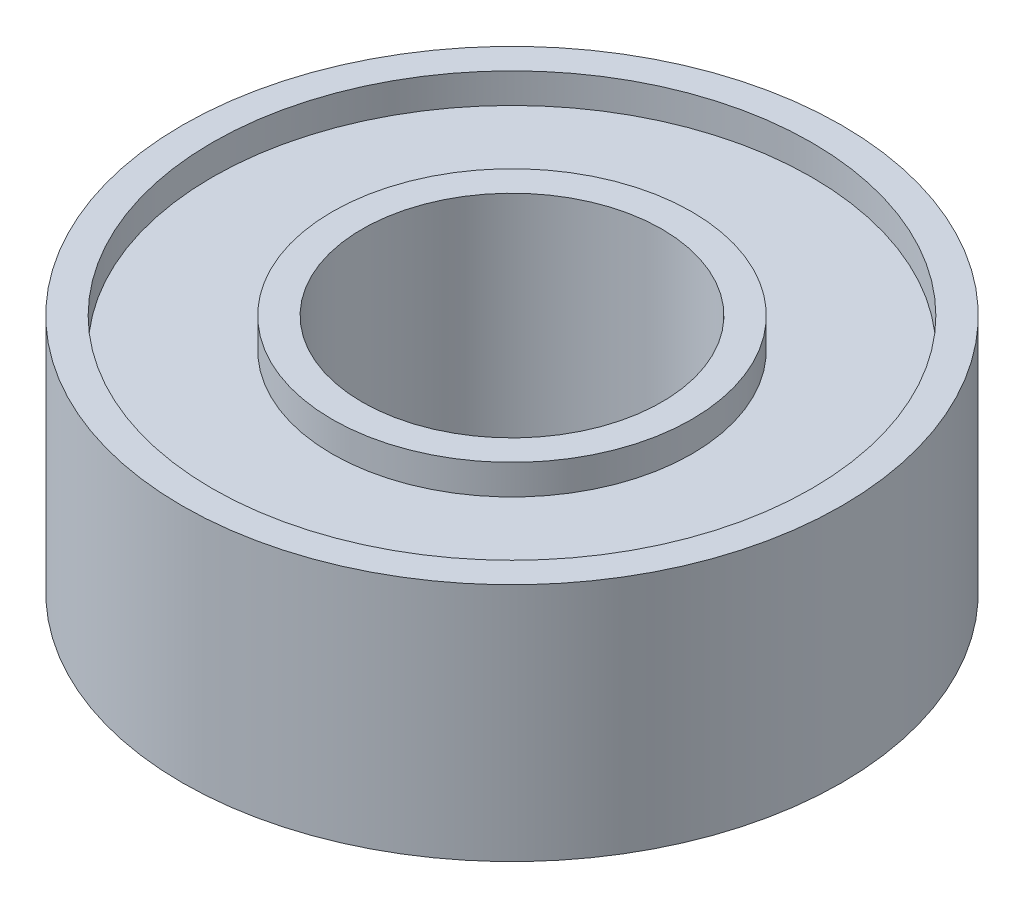
ISO-10303-21;
HEADER;
FILE_DESCRIPTION(('STEP AP214'),'2;1');
FILE_NAME('part.step','',(''),(''),'','','');
FILE_SCHEMA(('AUTOMOTIVE_DESIGN { 1 0 10303 214 1 1 1 1 }'));
ENDSEC;
DATA;
#1=APPLICATION_CONTEXT('core data for automotive mechanical design processes');
#2=APPLICATION_PROTOCOL_DEFINITION('international standard','automotive_design',2000,#1);
#3=PRODUCT_CONTEXT('',#1,'mechanical');
#4=PRODUCT('Part','Part','',(#3));
#5=PRODUCT_RELATED_PRODUCT_CATEGORY('part','',(#4));
#6=PRODUCT_DEFINITION_FORMATION('','',#4);
#7=PRODUCT_DEFINITION_CONTEXT('part definition',#1,'design');
#8=PRODUCT_DEFINITION('design','',#6,#7);
#9=PRODUCT_DEFINITION_SHAPE('','',#8);
#10=(LENGTH_UNIT() NAMED_UNIT(*) SI_UNIT(.MILLI.,.METRE.));
#11=(NAMED_UNIT(*) PLANE_ANGLE_UNIT() SI_UNIT($,.RADIAN.));
#12=(NAMED_UNIT(*) SI_UNIT($,.STERADIAN.) SOLID_ANGLE_UNIT());
#13=UNCERTAINTY_MEASURE_WITH_UNIT(LENGTH_MEASURE(1.E-05),#10,'distance_accuracy_value','');
#14=(GEOMETRIC_REPRESENTATION_CONTEXT(3) GLOBAL_UNCERTAINTY_ASSIGNED_CONTEXT((#13)) GLOBAL_UNIT_ASSIGNED_CONTEXT((#10,
#11,#12)) REPRESENTATION_CONTEXT('',''));
#15=CARTESIAN_POINT('',(0.,0.,0.));
#16=DIRECTION('',(0.,0.,1.));
#17=DIRECTION('',(1.,0.,0.));
#18=AXIS2_PLACEMENT_3D('',#15,#16,#17);
#19=CARTESIAN_POINT('',(0.,0.,0.));
#20=DIRECTION('',(0.,1.,0.));
#21=DIRECTION('',(0.,0.,1.));
#22=AXIS2_PLACEMENT_3D('',#19,#20,#21);
#23=PLANE('',#22);
#24=CARTESIAN_POINT('',(0.,0.,0.));
#25=DIRECTION('',(0.,1.,0.));
#26=DIRECTION('',(0.,0.,1.));
#27=AXIS2_PLACEMENT_3D('',#24,#25,#26);
#28=CIRCLE('',#27,2.5);
#29=CARTESIAN_POINT('',(0.,0.,2.5));
#30=VERTEX_POINT('',#29);
#31=EDGE_CURVE('E45',#30,#30,#28,.T.);
#32=ORIENTED_EDGE('',*,*,#31,.T.);
#33=EDGE_LOOP('',(#32));
#34=FACE_BOUND('',#33,.T.);
#35=CARTESIAN_POINT('',(0.,0.,0.));
#36=DIRECTION('',(0.,1.,0.));
#37=DIRECTION('',(0.,0.,1.));
#38=AXIS2_PLACEMENT_3D('',#35,#36,#37);
#39=CIRCLE('',#38,3.);
#40=CARTESIAN_POINT('',(0.,0.,3.));
#41=VERTEX_POINT('',#40);
#42=EDGE_CURVE('E69',#41,#41,#39,.T.);
#43=ORIENTED_EDGE('',*,*,#42,.F.);
#44=EDGE_LOOP('',(#43));
#45=FACE_BOUND('',#44,.T.);
#46=ADVANCED_FACE('F32',(#34,#45),#23,.F.);
#47=CARTESIAN_POINT('',(0.,4.,0.));
#48=DIRECTION('',(0.,1.,0.));
#49=DIRECTION('',(0.,0.,1.));
#50=AXIS2_PLACEMENT_3D('',#47,#48,#49);
#51=PLANE('',#50);
#52=CARTESIAN_POINT('',(0.,4.,0.));
#53=DIRECTION('',(0.,1.,0.));
#54=DIRECTION('',(0.,0.,1.));
#55=AXIS2_PLACEMENT_3D('',#52,#53,#54);
#56=CIRCLE('',#55,2.5);
#57=CARTESIAN_POINT('',(0.,4.,2.5));
#58=VERTEX_POINT('',#57);
#59=EDGE_CURVE('E43',#58,#58,#56,.T.);
#60=ORIENTED_EDGE('',*,*,#59,.F.);
#61=EDGE_LOOP('',(#60));
#62=FACE_BOUND('',#61,.T.);
#63=CARTESIAN_POINT('',(0.,4.,0.));
#64=DIRECTION('',(0.,1.,0.));
#65=DIRECTION('',(0.,0.,1.));
#66=AXIS2_PLACEMENT_3D('',#63,#64,#65);
#67=CIRCLE('',#66,3.);
#68=CARTESIAN_POINT('',(0.,4.,3.));
#69=VERTEX_POINT('',#68);
#70=EDGE_CURVE('E57',#69,#69,#67,.T.);
#71=ORIENTED_EDGE('',*,*,#70,.T.);
#72=EDGE_LOOP('',(#71));
#73=FACE_BOUND('',#72,.T.);
#74=ADVANCED_FACE('F85',(#62,#73),#51,.T.);
#75=CARTESIAN_POINT('',(0.,4.,0.));
#76=DIRECTION('',(0.,1.,0.));
#77=DIRECTION('',(0.,0.,1.));
#78=AXIS2_PLACEMENT_3D('',#75,#76,#77);
#79=CIRCLE('',#78,5.);
#80=CARTESIAN_POINT('',(0.,4.,5.));
#81=VERTEX_POINT('',#80);
#82=EDGE_CURVE('E51',#81,#81,#79,.T.);
#83=ORIENTED_EDGE('',*,*,#82,.F.);
#84=EDGE_LOOP('',(#83));
#85=FACE_BOUND('',#84,.T.);
#86=CARTESIAN_POINT('',(0.,4.,0.));
#87=DIRECTION('',(0.,1.,0.));
#88=DIRECTION('',(0.,0.,1.));
#89=AXIS2_PLACEMENT_3D('',#86,#87,#88);
#90=CIRCLE('',#89,5.5);
#91=CARTESIAN_POINT('',(0.,4.,5.5));
#92=VERTEX_POINT('',#91);
#93=EDGE_CURVE('E10',#92,#92,#90,.T.);
#94=ORIENTED_EDGE('',*,*,#93,.T.);
#95=EDGE_LOOP('',(#94));
#96=FACE_BOUND('',#95,.T.);
#97=ADVANCED_FACE('F91',(#85,#96),#51,.T.);
#98=CARTESIAN_POINT('',(0.,0.,0.));
#99=DIRECTION('',(0.,1.,0.));
#100=DIRECTION('',(0.,0.,1.));
#101=AXIS2_PLACEMENT_3D('',#98,#99,#100);
#102=CIRCLE('',#101,5.);
#103=CARTESIAN_POINT('',(0.,0.,5.));
#104=VERTEX_POINT('',#103);
#105=EDGE_CURVE('E63',#104,#104,#102,.T.);
#106=ORIENTED_EDGE('',*,*,#105,.T.);
#107=EDGE_LOOP('',(#106));
#108=FACE_BOUND('',#107,.T.);
#109=CARTESIAN_POINT('',(0.,0.,0.));
#110=DIRECTION('',(0.,1.,0.));
#111=DIRECTION('',(0.,0.,1.));
#112=AXIS2_PLACEMENT_3D('',#109,#110,#111);
#113=CIRCLE('',#112,5.5);
#114=CARTESIAN_POINT('',(0.,0.,5.5));
#115=VERTEX_POINT('',#114);
#116=EDGE_CURVE('E36',#115,#115,#113,.T.);
#117=ORIENTED_EDGE('',*,*,#116,.F.);
#118=EDGE_LOOP('',(#117));
#119=FACE_BOUND('',#118,.T.);
#120=ADVANCED_FACE('F87',(#108,#119),#23,.F.);
#121=CARTESIAN_POINT('',(0.,4.,0.));
#122=DIRECTION('',(0.,-1.,0.));
#123=DIRECTION('',(0.,0.,-1.));
#124=AXIS2_PLACEMENT_3D('',#121,#122,#123);
#125=CYLINDRICAL_SURFACE('',#124,5.5);
#126=ORIENTED_EDGE('',*,*,#93,.F.);
#127=EDGE_LOOP('',(#126));
#128=FACE_BOUND('',#127,.T.);
#129=ORIENTED_EDGE('',*,*,#116,.T.);
#130=EDGE_LOOP('',(#129));
#131=FACE_BOUND('',#130,.T.);
#132=ADVANCED_FACE('F34',(#128,#131),#125,.T.);
#133=CARTESIAN_POINT('',(0.,4.,0.));
#134=DIRECTION('',(0.,-1.,0.));
#135=DIRECTION('',(0.,0.,-1.));
#136=AXIS2_PLACEMENT_3D('',#133,#134,#135);
#137=CYLINDRICAL_SURFACE('',#136,2.5);
#138=ORIENTED_EDGE('',*,*,#59,.T.);
#139=EDGE_LOOP('',(#138));
#140=FACE_BOUND('',#139,.T.);
#141=ORIENTED_EDGE('',*,*,#31,.F.);
#142=EDGE_LOOP('',(#141));
#143=FACE_BOUND('',#142,.T.);
#144=ADVANCED_FACE('F100',(#140,#143),#137,.F.);
#145=CARTESIAN_POINT('',(0.,3.5,0.));
#146=DIRECTION('',(0.,1.,0.));
#147=DIRECTION('',(0.,0.,1.));
#148=AXIS2_PLACEMENT_3D('',#145,#146,#147);
#149=CYLINDRICAL_SURFACE('',#148,5.);
#150=CARTESIAN_POINT('',(0.,3.5,0.));
#151=DIRECTION('',(0.,1.,0.));
#152=DIRECTION('',(0.,0.,1.));
#153=AXIS2_PLACEMENT_3D('',#150,#151,#152);
#154=CIRCLE('',#153,5.);
#155=CARTESIAN_POINT('',(0.,3.5,5.));
#156=VERTEX_POINT('',#155);
#157=EDGE_CURVE('E48',#156,#156,#154,.T.);
#158=ORIENTED_EDGE('',*,*,#157,.F.);
#159=EDGE_LOOP('',(#158));
#160=FACE_BOUND('',#159,.T.);
#161=ORIENTED_EDGE('',*,*,#82,.T.);
#162=EDGE_LOOP('',(#161));
#163=FACE_BOUND('',#162,.T.);
#164=ADVANCED_FACE('F124',(#160,#163),#149,.F.);
#165=CARTESIAN_POINT('',(0.,3.5,0.));
#166=DIRECTION('',(0.,1.,0.));
#167=DIRECTION('',(0.,0.,1.));
#168=AXIS2_PLACEMENT_3D('',#165,#166,#167);
#169=PLANE('',#168);
#170=CARTESIAN_POINT('',(0.,3.5,0.));
#171=DIRECTION('',(0.,1.,0.));
#172=DIRECTION('',(0.,0.,1.));
#173=AXIS2_PLACEMENT_3D('',#170,#171,#172);
#174=CIRCLE('',#173,3.);
#175=CARTESIAN_POINT('',(0.,3.5,3.));
#176=VERTEX_POINT('',#175);
#177=EDGE_CURVE('E54',#176,#176,#174,.T.);
#178=ORIENTED_EDGE('',*,*,#177,.F.);
#179=EDGE_LOOP('',(#178));
#180=FACE_BOUND('',#179,.T.);
#181=ORIENTED_EDGE('',*,*,#157,.T.);
#182=EDGE_LOOP('',(#181));
#183=FACE_BOUND('',#182,.T.);
#184=ADVANCED_FACE('F120',(#180,#183),#169,.T.);
#185=CARTESIAN_POINT('',(0.,3.5,0.));
#186=DIRECTION('',(0.,1.,0.));
#187=DIRECTION('',(0.,0.,1.));
#188=AXIS2_PLACEMENT_3D('',#185,#186,#187);
#189=CYLINDRICAL_SURFACE('',#188,3.);
#190=ORIENTED_EDGE('',*,*,#177,.T.);
#191=EDGE_LOOP('',(#190));
#192=FACE_BOUND('',#191,.T.);
#193=ORIENTED_EDGE('',*,*,#70,.F.);
#194=EDGE_LOOP('',(#193));
#195=FACE_BOUND('',#194,.T.);
#196=ADVANCED_FACE('F114',(#192,#195),#189,.T.);
#197=CARTESIAN_POINT('',(0.,0.5,0.));
#198=DIRECTION('',(0.,1.,0.));
#199=DIRECTION('',(0.,0.,1.));
#200=AXIS2_PLACEMENT_3D('',#197,#198,#199);
#201=PLANE('',#200);
#202=CARTESIAN_POINT('',(0.,0.5,0.));
#203=DIRECTION('',(0.,1.,0.));
#204=DIRECTION('',(0.,0.,1.));
#205=AXIS2_PLACEMENT_3D('',#202,#203,#204);
#206=CIRCLE('',#205,5.);
#207=CARTESIAN_POINT('',(0.,0.5,5.));
#208=VERTEX_POINT('',#207);
#209=EDGE_CURVE('E60',#208,#208,#206,.T.);
#210=ORIENTED_EDGE('',*,*,#209,.F.);
#211=EDGE_LOOP('',(#210));
#212=FACE_BOUND('',#211,.T.);
#213=CARTESIAN_POINT('',(0.,0.5,0.));
#214=DIRECTION('',(0.,1.,0.));
#215=DIRECTION('',(0.,0.,1.));
#216=AXIS2_PLACEMENT_3D('',#213,#214,#215);
#217=CIRCLE('',#216,3.);
#218=CARTESIAN_POINT('',(0.,0.5,3.));
#219=VERTEX_POINT('',#218);
#220=EDGE_CURVE('E66',#219,#219,#217,.T.);
#221=ORIENTED_EDGE('',*,*,#220,.T.);
#222=EDGE_LOOP('',(#221));
#223=FACE_BOUND('',#222,.T.);
#224=ADVANCED_FACE('F75',(#212,#223),#201,.F.);
#225=CARTESIAN_POINT('',(0.,0.5,0.));
#226=DIRECTION('',(0.,-1.,0.));
#227=DIRECTION('',(0.,0.,-1.));
#228=AXIS2_PLACEMENT_3D('',#225,#226,#227);
#229=CYLINDRICAL_SURFACE('',#228,5.);
#230=ORIENTED_EDGE('',*,*,#209,.T.);
#231=EDGE_LOOP('',(#230));
#232=FACE_BOUND('',#231,.T.);
#233=ORIENTED_EDGE('',*,*,#105,.F.);
#234=EDGE_LOOP('',(#233));
#235=FACE_BOUND('',#234,.T.);
#236=ADVANCED_FACE('F80',(#232,#235),#229,.F.);
#237=CARTESIAN_POINT('',(0.,0.5,0.));
#238=DIRECTION('',(0.,-1.,0.));
#239=DIRECTION('',(0.,0.,-1.));
#240=AXIS2_PLACEMENT_3D('',#237,#238,#239);
#241=CYLINDRICAL_SURFACE('',#240,3.);
#242=ORIENTED_EDGE('',*,*,#220,.F.);
#243=EDGE_LOOP('',(#242));
#244=FACE_BOUND('',#243,.T.);
#245=ORIENTED_EDGE('',*,*,#42,.T.);
#246=EDGE_LOOP('',(#245));
#247=FACE_BOUND('',#246,.T.);
#248=ADVANCED_FACE('F77',(#244,#247),#241,.T.);
#249=CLOSED_SHELL('',(#46,#74,#97,#120,#132,#144,#164,#184,#196,#224,#236,#248));
#250=MANIFOLD_SOLID_BREP('B2',#249);
#251=ADVANCED_BREP_SHAPE_REPRESENTATION('',(#18,#250),#14);
#252=SHAPE_DEFINITION_REPRESENTATION(#9,#251);
ENDSEC;
END-ISO-10303-21;
